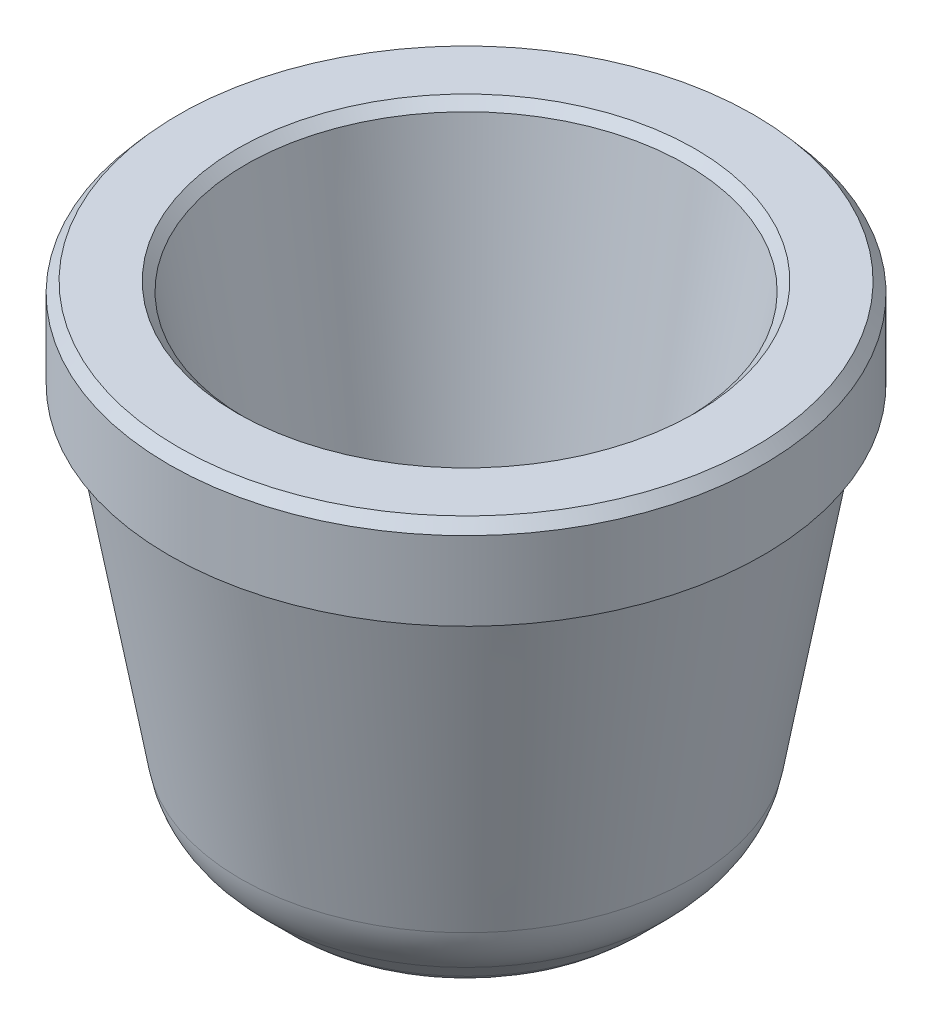
ISO-10303-21;
HEADER;
FILE_DESCRIPTION(('STEP AP214'),'2;1');
FILE_NAME('part.step','',(''),(''),'','','');
FILE_SCHEMA(('AUTOMOTIVE_DESIGN { 1 0 10303 214 1 1 1 1 }'));
ENDSEC;
DATA;
#1=APPLICATION_CONTEXT('core data for automotive mechanical design processes');
#2=APPLICATION_PROTOCOL_DEFINITION('international standard','automotive_design',2000,#1);
#3=PRODUCT_CONTEXT('',#1,'mechanical');
#4=PRODUCT('Part','Part','',(#3));
#5=PRODUCT_RELATED_PRODUCT_CATEGORY('part','',(#4));
#6=PRODUCT_DEFINITION_FORMATION('','',#4);
#7=PRODUCT_DEFINITION_CONTEXT('part definition',#1,'design');
#8=PRODUCT_DEFINITION('design','',#6,#7);
#9=PRODUCT_DEFINITION_SHAPE('','',#8);
#10=(LENGTH_UNIT() NAMED_UNIT(*) SI_UNIT(.MILLI.,.METRE.));
#11=(NAMED_UNIT(*) PLANE_ANGLE_UNIT() SI_UNIT($,.RADIAN.));
#12=(NAMED_UNIT(*) SI_UNIT($,.STERADIAN.) SOLID_ANGLE_UNIT());
#13=UNCERTAINTY_MEASURE_WITH_UNIT(LENGTH_MEASURE(1.E-05),#10,'distance_accuracy_value','');
#14=(GEOMETRIC_REPRESENTATION_CONTEXT(3) GLOBAL_UNCERTAINTY_ASSIGNED_CONTEXT((#13)) GLOBAL_UNIT_ASSIGNED_CONTEXT((#10,
#11,#12)) REPRESENTATION_CONTEXT('',''));
#15=CARTESIAN_POINT('',(0.,0.,0.));
#16=DIRECTION('',(0.,0.,1.));
#17=DIRECTION('',(1.,0.,0.));
#18=AXIS2_PLACEMENT_3D('',#15,#16,#17);
#19=CARTESIAN_POINT('',(0.,0.,0.));
#20=DIRECTION('',(0.,1.,0.));
#21=DIRECTION('',(0.,0.,1.));
#22=AXIS2_PLACEMENT_3D('',#19,#20,#21);
#23=PLANE('',#22);
#24=CARTESIAN_POINT('',(0.,0.,0.));
#25=DIRECTION('',(0.,1.,0.));
#26=DIRECTION('',(0.,0.,1.));
#27=AXIS2_PLACEMENT_3D('',#24,#25,#26);
#28=CIRCLE('',#27,4.92343401241865);
#29=CARTESIAN_POINT('',(0.,0.,4.92343401241865));
#30=VERTEX_POINT('',#29);
#31=EDGE_CURVE('E43',#30,#30,#28,.T.);
#32=ORIENTED_EDGE('',*,*,#31,.T.);
#33=EDGE_LOOP('',(#32));
#34=FACE_BOUND('',#33,.T.);
#35=CARTESIAN_POINT('',(0.,0.,0.));
#36=DIRECTION('',(0.,1.,0.));
#37=DIRECTION('',(0.,0.,1.));
#38=AXIS2_PLACEMENT_3D('',#35,#36,#37);
#39=CIRCLE('',#38,3.91740820290511);
#40=CARTESIAN_POINT('',(0.,0.,3.91740820290511));
#41=VERTEX_POINT('',#40);
#42=EDGE_CURVE('E47',#41,#41,#39,.F.);
#43=ORIENTED_EDGE('',*,*,#42,.T.);
#44=EDGE_LOOP('',(#43));
#45=FACE_BOUND('',#44,.T.);
#46=ADVANCED_FACE('F32',(#34,#45),#23,.T.);
#47=CARTESIAN_POINT('',(0.,0.220533185636993,0.));
#48=DIRECTION('',(0.,1.,0.));
#49=DIRECTION('',(0.,0.,1.));
#50=AXIS2_PLACEMENT_3D('',#47,#48,#49);
#51=CONICAL_SURFACE('',#50,3.8292941536745,0.174532925199426);
#52=CARTESIAN_POINT('',(0.,-0.154187398428126,0.));
#53=DIRECTION('',(0.,1.,0.));
#54=DIRECTION('',(0.,0.,1.));
#55=AXIS2_PLACEMENT_3D('',#52,#53,#54);
#56=CIRCLE('',#55,3.76322080447698);
#57=CARTESIAN_POINT('',(0.,-0.154187398428126,3.76322080447698));
#58=VERTEX_POINT('',#57);
#59=EDGE_CURVE('E10',#58,#58,#56,.T.);
#60=ORIENTED_EDGE('',*,*,#59,.T.);
#61=EDGE_LOOP('',(#60));
#62=FACE_BOUND('',#61,.T.);
#63=CARTESIAN_POINT('',(0.,-6.70724669260454,0.));
#64=DIRECTION('',(0.,1.,0.));
#65=DIRECTION('',(0.,0.,1.));
#66=AXIS2_PLACEMENT_3D('',#63,#64,#65);
#67=CIRCLE('',#66,2.60773964473136);
#68=CARTESIAN_POINT('',(0.,-6.70724669260454,2.60773964473136));
#69=VERTEX_POINT('',#68);
#70=EDGE_CURVE('E56',#69,#69,#67,.T.);
#71=ORIENTED_EDGE('',*,*,#70,.F.);
#72=EDGE_LOOP('',(#71));
#73=FACE_BOUND('',#72,.T.);
#74=ADVANCED_FACE('F101',(#62,#73),#51,.F.);
#75=CARTESIAN_POINT('',(0.,-6.50296951244298,0.));
#76=DIRECTION('',(0.,1.,0.));
#77=DIRECTION('',(0.,0.,1.));
#78=AXIS2_PLACEMENT_3D('',#75,#76,#77);
#79=CONICAL_SURFACE('',#78,2.87697926334318,0.785398163397446);
#80=CARTESIAN_POINT('',(0.,-6.84274517789853,0.));
#81=DIRECTION('',(0.,1.,0.));
#82=DIRECTION('',(0.,0.,1.));
#83=AXIS2_PLACEMENT_3D('',#80,#81,#82);
#84=CIRCLE('',#83,2.53720359788764);
#85=CARTESIAN_POINT('',(0.,-6.84274517789853,2.53720359788764));
#86=VERTEX_POINT('',#85);
#87=EDGE_CURVE('E72',#86,#86,#84,.F.);
#88=ORIENTED_EDGE('',*,*,#87,.F.);
#89=EDGE_LOOP('',(#88));
#90=FACE_BOUND('',#89,.T.);
#91=CARTESIAN_POINT('',(0.,-7.29160512242138,0.));
#92=DIRECTION('',(0.,1.,0.));
#93=DIRECTION('',(0.,0.,1.));
#94=AXIS2_PLACEMENT_3D('',#91,#92,#93);
#95=CIRCLE('',#94,2.08834365336478);
#96=CARTESIAN_POINT('',(0.,-7.29160512242138,2.08834365336478));
#97=VERTEX_POINT('',#96);
#98=EDGE_CURVE('E73',#97,#97,#95,.T.);
#99=ORIENTED_EDGE('',*,*,#98,.F.);
#100=EDGE_LOOP('',(#99));
#101=FACE_BOUND('',#100,.T.);
#102=ADVANCED_FACE('F107',(#90,#101),#79,.F.);
#103=CARTESIAN_POINT('',(2.54,-7.366,0.));
#104=DIRECTION('',(0.,-1.,0.));
#105=DIRECTION('',(0.,0.,-1.));
#106=AXIS2_PLACEMENT_3D('',#103,#104,#105);
#107=PLANE('',#106);
#108=CARTESIAN_POINT('',(0.,-7.366,0.));
#109=DIRECTION('',(0.,-1.,0.));
#110=DIRECTION('',(0.,0.,-1.));
#111=AXIS2_PLACEMENT_3D('',#108,#109,#110);
#112=CIRCLE('',#111,1.9087385309434);
#113=CARTESIAN_POINT('',(0.,-7.366,-1.9087385309434));
#114=VERTEX_POINT('',#113);
#115=EDGE_CURVE('E69',#114,#114,#112,.T.);
#116=ORIENTED_EDGE('',*,*,#115,.F.);
#117=EDGE_LOOP('',(#116));
#118=FACE_BOUND('',#117,.T.);
#119=ADVANCED_FACE('F179',(#118),#107,.F.);
#120=CARTESIAN_POINT('',(0.,-6.66314005547714,0.));
#121=DIRECTION('',(0.,-1.,0.));
#122=DIRECTION('',(0.,0.,-1.));
#123=AXIS2_PLACEMENT_3D('',#120,#121,#122);
#124=TOROIDAL_SURFACE('',#123,2.35759847546626,0.254);
#125=ORIENTED_EDGE('',*,*,#87,.T.);
#126=EDGE_LOOP('',(#125));
#127=FACE_BOUND('',#126,.T.);
#128=ORIENTED_EDGE('',*,*,#70,.T.);
#129=EDGE_LOOP('',(#128));
#130=FACE_BOUND('',#129,.T.);
#131=ADVANCED_FACE('F188',(#127,#130),#124,.F.);
#132=CARTESIAN_POINT('',(0.,-7.112,0.));
#133=DIRECTION('',(0.,-1.,0.));
#134=DIRECTION('',(0.,0.,-1.));
#135=AXIS2_PLACEMENT_3D('',#132,#133,#134);
#136=TOROIDAL_SURFACE('',#135,1.9087385309434,0.254);
#137=ORIENTED_EDGE('',*,*,#115,.T.);
#138=EDGE_LOOP('',(#137));
#139=FACE_BOUND('',#138,.T.);
#140=ORIENTED_EDGE('',*,*,#98,.T.);
#141=EDGE_LOOP('',(#140));
#142=FACE_BOUND('',#141,.T.);
#143=ADVANCED_FACE('F97',(#139,#142),#136,.F.);
#144=CARTESIAN_POINT('',(0.,-1.524,0.));
#145=DIRECTION('',(0.,1.,0.));
#146=DIRECTION('',(0.,0.,1.));
#147=AXIS2_PLACEMENT_3D('',#144,#145,#146);
#148=CYLINDRICAL_SURFACE('',#147,5.08);
#149=CARTESIAN_POINT('',(0.,-0.181374796856249,0.));
#150=DIRECTION('',(0.,1.,0.));
#151=DIRECTION('',(0.,0.,1.));
#152=AXIS2_PLACEMENT_3D('',#149,#150,#151);
#153=CIRCLE('',#152,5.08);
#154=CARTESIAN_POINT('',(0.,-0.18137479685625,5.08));
#155=VERTEX_POINT('',#154);
#156=EDGE_CURVE('E39',#155,#155,#153,.F.);
#157=CARTESIAN_POINT('',(0.,-1.524,0.));
#158=DIRECTION('',(0.,1.,0.));
#159=DIRECTION('',(0.,0.,1.));
#160=AXIS2_PLACEMENT_3D('',#157,#158,#159);
#161=CIRCLE('',#160,5.08);
#162=CARTESIAN_POINT('',(0.,-1.524,5.08));
#163=VERTEX_POINT('',#162);
#164=EDGE_CURVE('E57',#163,#163,#161,.T.);
#165=CARTESIAN_POINT('',(0.,-0.18137479685625,5.08));
#166=CARTESIAN_POINT('',(0.,-0.195360476055664,5.08));
#167=CARTESIAN_POINT('',(0.,-0.209346155255078,5.08));
#168=CARTESIAN_POINT('',(0.,-0.237317513653906,5.08));
#169=CARTESIAN_POINT('',(0.,-0.25130319285332,5.08));
#170=CARTESIAN_POINT('',(0.,-0.279274551252148,5.08));
#171=CARTESIAN_POINT('',(0.,-0.293260230451562,5.08));
#172=CARTESIAN_POINT('',(0.,-0.32123158885039,5.08));
#173=CARTESIAN_POINT('',(0.,-0.335217268049804,5.08));
#174=CARTESIAN_POINT('',(0.,-0.363188626448632,5.08));
#175=CARTESIAN_POINT('',(0.,-0.377174305648046,5.08));
#176=CARTESIAN_POINT('',(0.,-0.405145664046875,5.08));
#177=CARTESIAN_POINT('',(0.,-0.419131343246289,5.08));
#178=CARTESIAN_POINT('',(0.,-0.447102701645117,5.08));
#179=CARTESIAN_POINT('',(0.,-0.461088380844531,5.08));
#180=CARTESIAN_POINT('',(0.,-0.489059739243359,5.08));
#181=CARTESIAN_POINT('',(0.,-0.503045418442773,5.08));
#182=CARTESIAN_POINT('',(0.,-0.531016776841601,5.08));
#183=CARTESIAN_POINT('',(0.,-0.545002456041015,5.08));
#184=CARTESIAN_POINT('',(0.,-0.572973814439843,5.08));
#185=CARTESIAN_POINT('',(0.,-0.586959493639257,5.08));
#186=CARTESIAN_POINT('',(0.,-0.614930852038086,5.08));
#187=CARTESIAN_POINT('',(0.,-0.6289165312375,5.08));
#188=CARTESIAN_POINT('',(0.,-0.656887889636328,5.08));
#189=CARTESIAN_POINT('',(0.,-0.670873568835742,5.08));
#190=CARTESIAN_POINT('',(0.,-0.69884492723457,5.08));
#191=CARTESIAN_POINT('',(0.,-0.712830606433984,5.08));
#192=CARTESIAN_POINT('',(0.,-0.740801964832812,5.08));
#193=CARTESIAN_POINT('',(0.,-0.754787644032226,5.08));
#194=CARTESIAN_POINT('',(0.,-0.782759002431054,5.08));
#195=CARTESIAN_POINT('',(0.,-0.796744681630469,5.08));
#196=CARTESIAN_POINT('',(0.,-0.824716040029297,5.08));
#197=CARTESIAN_POINT('',(0.,-0.838701719228711,5.08));
#198=CARTESIAN_POINT('',(0.,-0.866673077627539,5.08));
#199=CARTESIAN_POINT('',(0.,-0.880658756826953,5.08));
#200=CARTESIAN_POINT('',(0.,-0.908630115225781,5.08));
#201=CARTESIAN_POINT('',(0.,-0.922615794425195,5.08));
#202=CARTESIAN_POINT('',(0.,-0.950587152824023,5.08));
#203=CARTESIAN_POINT('',(0.,-0.964572832023437,5.08));
#204=CARTESIAN_POINT('',(0.,-0.992544190422266,5.08));
#205=CARTESIAN_POINT('',(0.,-1.00652986962168,5.08));
#206=CARTESIAN_POINT('',(0.,-1.03450122802051,5.08));
#207=CARTESIAN_POINT('',(0.,-1.04848690721992,5.08));
#208=CARTESIAN_POINT('',(0.,-1.07645826561875,5.08));
#209=CARTESIAN_POINT('',(0.,-1.09044394481816,5.08));
#210=CARTESIAN_POINT('',(0.,-1.11841530321699,5.08));
#211=CARTESIAN_POINT('',(0.,-1.13240098241641,5.08));
#212=CARTESIAN_POINT('',(0.,-1.16037234081523,5.08));
#213=CARTESIAN_POINT('',(0.,-1.17435802001465,5.08));
#214=CARTESIAN_POINT('',(0.,-1.20232937841348,5.08));
#215=CARTESIAN_POINT('',(0.,-1.21631505761289,5.08));
#216=CARTESIAN_POINT('',(0.,-1.24428641601172,5.08));
#217=CARTESIAN_POINT('',(0.,-1.25827209521113,5.08));
#218=CARTESIAN_POINT('',(0.,-1.28624345360996,5.08));
#219=CARTESIAN_POINT('',(0.,-1.30022913280937,5.08));
#220=CARTESIAN_POINT('',(0.,-1.3282004912082,5.08));
#221=CARTESIAN_POINT('',(0.,-1.34218617040762,5.08));
#222=CARTESIAN_POINT('',(0.,-1.37015752880645,5.08));
#223=CARTESIAN_POINT('',(0.,-1.38414320800586,5.08));
#224=CARTESIAN_POINT('',(0.,-1.41211456640469,5.08));
#225=CARTESIAN_POINT('',(0.,-1.4261002456041,5.08));
#226=CARTESIAN_POINT('',(0.,-1.45407160400293,5.08));
#227=CARTESIAN_POINT('',(0.,-1.46805728320234,5.08));
#228=CARTESIAN_POINT('',(0.,-1.49602864160117,5.08));
#229=CARTESIAN_POINT('',(0.,-1.51001432080059,5.08));
#230=CARTESIAN_POINT('',(0.,-1.524,5.08));
#231=B_SPLINE_CURVE_WITH_KNOTS('',3,(#165,#166,#167,#168,#169,#170,#171,#172,#173,#174,#175,
#176,#177,#178,#179,#180,#181,#182,#183,#184,#185,#186,#187,#188,#189,#190,#191,#192,#193,#194,
#195,#196,#197,#198,#199,#200,#201,#202,#203,#204,#205,#206,#207,#208,#209,#210,#211,#212,#213,
#214,#215,#216,#217,#218,#219,#220,#221,#222,#223,#224,#225,#226,#227,#228,#229,#230),
.UNSPECIFIED.,.F.,.F.,(4,2,2,2,2,2,2,2,2,2,2,2,2,2,2,2,2,2,2,2,2,2,2,2,2,2,2,2,2,2,2,2,4),(0.,
0.0419570375982422,0.0839140751964845,0.125871112794727,0.167828150392969,0.209785187991211,
0.251742225589453,0.293699263187696,0.335656300785938,0.37761333838418,0.419570375982422,
0.461527413580664,0.503484451178906,0.545441488777149,0.587398526375391,0.629355563973633,
0.671312601571875,0.713269639170117,0.75522667676836,0.797183714366602,0.839140751964844,
0.881097789563086,0.923054827161328,0.965011864759571,1.00696890235781,1.04892593995605,
1.0908829775543,1.13284001515254,1.17479705275078,1.21675409034902,1.25871112794727,
1.30066816554551,1.34262520314375),.UNSPECIFIED.);
#232=EDGE_CURVE('BSEAM83',#155,#163,#231,.T.);
#233=ORIENTED_EDGE('',*,*,#156,.T.);
#234=ORIENTED_EDGE('',*,*,#164,.T.);
#235=ORIENTED_EDGE('',*,*,#232,.T.);
#236=ORIENTED_EDGE('',*,*,#232,.F.);
#237=EDGE_LOOP('',(#233,#235,#234,#236));
#238=FACE_BOUND('',#237,.T.);
#239=ADVANCED_FACE('F83',(#238),#148,.T.);
#240=CARTESIAN_POINT('',(0.,-1.524,0.));
#241=DIRECTION('',(0.,1.,0.));
#242=DIRECTION('',(0.,0.,1.));
#243=AXIS2_PLACEMENT_3D('',#240,#241,#242);
#244=PLANE('',#243);
#245=CARTESIAN_POINT('',(0.,-1.524,0.));
#246=DIRECTION('',(0.,1.,0.));
#247=DIRECTION('',(0.,0.,1.));
#248=AXIS2_PLACEMENT_3D('',#245,#246,#247);
#249=CIRCLE('',#248,4.81127768140031);
#250=CARTESIAN_POINT('',(0.,-1.524,4.81127768140031));
#251=VERTEX_POINT('',#250);
#252=EDGE_CURVE('E53',#251,#251,#249,.F.);
#253=ORIENTED_EDGE('',*,*,#252,.F.);
#254=EDGE_LOOP('',(#253));
#255=FACE_BOUND('',#254,.T.);
#256=ORIENTED_EDGE('',*,*,#164,.F.);
#257=EDGE_LOOP('',(#256));
#258=FACE_BOUND('',#257,.T.);
#259=ADVANCED_FACE('F85',(#255,#258),#244,.F.);
#260=CARTESIAN_POINT('',(2.54,-8.636,0.));
#261=DIRECTION('',(0.,-1.,0.));
#262=DIRECTION('',(0.,0.,-1.));
#263=AXIS2_PLACEMENT_3D('',#260,#261,#262);
#264=PLANE('',#263);
#265=CARTESIAN_POINT('',(0.,-8.636,0.));
#266=DIRECTION('',(0.,-1.,0.));
#267=DIRECTION('',(0.,0.,-1.));
#268=AXIS2_PLACEMENT_3D('',#265,#266,#267);
#269=CIRCLE('',#268,1.9087385309434);
#270=CARTESIAN_POINT('',(0.,-8.636,-1.9087385309434));
#271=VERTEX_POINT('',#270);
#272=EDGE_CURVE('E52',#271,#271,#269,.T.);
#273=ORIENTED_EDGE('',*,*,#272,.T.);
#274=EDGE_LOOP('',(#273));
#275=FACE_BOUND('',#274,.T.);
#276=ADVANCED_FACE('F87',(#275),#264,.T.);
#277=CARTESIAN_POINT('',(0.,-7.112,0.));
#278=DIRECTION('',(0.,-1.,0.));
#279=DIRECTION('',(0.,0.,-1.));
#280=AXIS2_PLACEMENT_3D('',#277,#278,#279);
#281=TOROIDAL_SURFACE('',#280,1.9087385309434,1.524);
#282=ORIENTED_EDGE('',*,*,#272,.F.);
#283=EDGE_LOOP('',(#282));
#284=FACE_BOUND('',#283,.T.);
#285=CARTESIAN_POINT('',(0.,-8.1896307345283,0.));
#286=DIRECTION('',(0.,-1.,0.));
#287=DIRECTION('',(0.,0.,-1.));
#288=AXIS2_PLACEMENT_3D('',#285,#286,#287);
#289=CIRCLE('',#288,2.9863692654717);
#290=CARTESIAN_POINT('',(0.,-8.1896307345283,-2.9863692654717));
#291=VERTEX_POINT('',#290);
#292=EDGE_CURVE('E63',#291,#291,#289,.F.);
#293=ORIENTED_EDGE('',*,*,#292,.F.);
#294=EDGE_LOOP('',(#293));
#295=FACE_BOUND('',#294,.T.);
#296=ADVANCED_FACE('F94',(#284,#295),#281,.T.);
#297=CARTESIAN_POINT('',(0.,-7.40099512454989,0.));
#298=DIRECTION('',(0.,1.,0.));
#299=DIRECTION('',(0.,0.,1.));
#300=AXIS2_PLACEMENT_3D('',#297,#298,#299);
#301=CONICAL_SURFACE('',#300,3.7750048754501,0.785398163397446);
#302=CARTESIAN_POINT('',(0.,-7.74077079000544,0.));
#303=DIRECTION('',(0.,-1.,0.));
#304=DIRECTION('',(0.,0.,-1.));
#305=AXIS2_PLACEMENT_3D('',#302,#303,#304);
#306=CIRCLE('',#305,3.43522920999456);
#307=CARTESIAN_POINT('',(0.,-7.74077079000544,-3.43522920999456));
#308=VERTEX_POINT('',#307);
#309=EDGE_CURVE('E60',#308,#308,#306,.T.);
#310=ORIENTED_EDGE('',*,*,#309,.T.);
#311=EDGE_LOOP('',(#310));
#312=FACE_BOUND('',#311,.T.);
#313=ORIENTED_EDGE('',*,*,#292,.T.);
#314=EDGE_LOOP('',(#313));
#315=FACE_BOUND('',#314,.T.);
#316=ADVANCED_FACE('F117',(#312,#315),#301,.T.);
#317=CARTESIAN_POINT('',(0.,-6.66314005547714,0.));
#318=DIRECTION('',(0.,-1.,0.));
#319=DIRECTION('',(0.,0.,-1.));
#320=AXIS2_PLACEMENT_3D('',#317,#318,#319);
#321=TOROIDAL_SURFACE('',#320,2.35759847546626,1.524);
#322=ORIENTED_EDGE('',*,*,#309,.F.);
#323=EDGE_LOOP('',(#322));
#324=FACE_BOUND('',#323,.T.);
#325=CARTESIAN_POINT('',(0.,-6.92777987824153,0.));
#326=DIRECTION('',(0.,-1.,0.));
#327=DIRECTION('',(0.,0.,-1.));
#328=AXIS2_PLACEMENT_3D('',#325,#326,#327);
#329=CIRCLE('',#328,3.85844549105686);
#330=CARTESIAN_POINT('',(0.,-6.92777987824153,-3.85844549105686));
#331=VERTEX_POINT('',#330);
#332=EDGE_CURVE('E66',#331,#331,#329,.F.);
#333=ORIENTED_EDGE('',*,*,#332,.F.);
#334=EDGE_LOOP('',(#333));
#335=FACE_BOUND('',#334,.T.);
#336=ADVANCED_FACE('F114',(#324,#335),#321,.T.);
#337=CARTESIAN_POINT('',(0.,0.,0.));
#338=DIRECTION('',(0.,1.,0.));
#339=DIRECTION('',(0.,0.,1.));
#340=AXIS2_PLACEMENT_3D('',#337,#338,#339);
#341=CONICAL_SURFACE('',#340,5.08,0.174532925199426);
#342=ORIENTED_EDGE('',*,*,#332,.T.);
#343=EDGE_LOOP('',(#342));
#344=FACE_BOUND('',#343,.T.);
#345=ORIENTED_EDGE('',*,*,#252,.T.);
#346=EDGE_LOOP('',(#345));
#347=FACE_BOUND('',#346,.T.);
#348=ADVANCED_FACE('F112',(#344,#347),#341,.T.);
#349=CARTESIAN_POINT('',(0.,0.,0.));
#350=DIRECTION('',(0.,-1.,0.));
#351=DIRECTION('',(0.,0.,-1.));
#352=AXIS2_PLACEMENT_3D('',#349,#350,#351);
#353=CONICAL_SURFACE('',#352,4.92343401241865,0.712117912004432);
#354=ORIENTED_EDGE('',*,*,#156,.F.);
#355=EDGE_LOOP('',(#354));
#356=FACE_BOUND('',#355,.T.);
#357=ORIENTED_EDGE('',*,*,#31,.F.);
#358=EDGE_LOOP('',(#357));
#359=FACE_BOUND('',#358,.T.);
#360=ADVANCED_FACE('F121',(#356,#359),#353,.T.);
#361=CARTESIAN_POINT('',(0.,-0.154187398428126,0.));
#362=DIRECTION('',(0.,1.,0.));
#363=DIRECTION('',(0.,0.,1.));
#364=AXIS2_PLACEMENT_3D('',#361,#362,#363);
#365=CONICAL_SURFACE('',#364,3.76322080447698,0.785398163397444);
#366=ORIENTED_EDGE('',*,*,#42,.F.);
#367=EDGE_LOOP('',(#366));
#368=FACE_BOUND('',#367,.T.);
#369=ORIENTED_EDGE('',*,*,#59,.F.);
#370=EDGE_LOOP('',(#369));
#371=FACE_BOUND('',#370,.T.);
#372=ADVANCED_FACE('F34',(#368,#371),#365,.F.);
#373=CLOSED_SHELL('',(#46,#74,#102,#119,#131,#143,#239,#259,#276,#296,#316,#336,#348,#360,#372));
#374=MANIFOLD_SOLID_BREP('B2',#373);
#375=ADVANCED_BREP_SHAPE_REPRESENTATION('',(#18,#374),#14);
#376=SHAPE_DEFINITION_REPRESENTATION(#9,#375);
ENDSEC;
END-ISO-10303-21;
